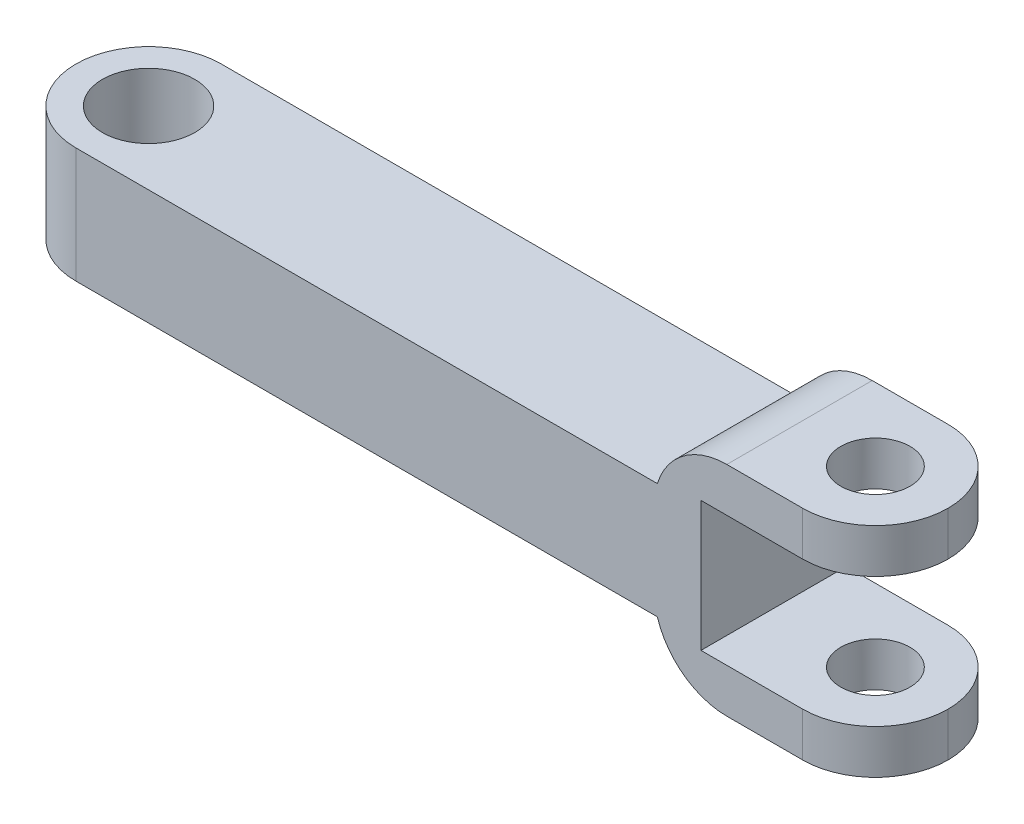
ISO-10303-21;
HEADER;
FILE_DESCRIPTION(('STEP AP214'),'2;1');
FILE_NAME('part.step','',(''),(''),'','','');
FILE_SCHEMA(('AUTOMOTIVE_DESIGN { 1 0 10303 214 1 1 1 1 }'));
ENDSEC;
DATA;
#1=APPLICATION_CONTEXT('core data for automotive mechanical design processes');
#2=APPLICATION_PROTOCOL_DEFINITION('international standard','automotive_design',2000,#1);
#3=PRODUCT_CONTEXT('',#1,'mechanical');
#4=PRODUCT('Part','Part','',(#3));
#5=PRODUCT_RELATED_PRODUCT_CATEGORY('part','',(#4));
#6=PRODUCT_DEFINITION_FORMATION('','',#4);
#7=PRODUCT_DEFINITION_CONTEXT('part definition',#1,'design');
#8=PRODUCT_DEFINITION('design','',#6,#7);
#9=PRODUCT_DEFINITION_SHAPE('','',#8);
#10=(LENGTH_UNIT() NAMED_UNIT(*) SI_UNIT(.MILLI.,.METRE.));
#11=(NAMED_UNIT(*) PLANE_ANGLE_UNIT() SI_UNIT($,.RADIAN.));
#12=(NAMED_UNIT(*) SI_UNIT($,.STERADIAN.) SOLID_ANGLE_UNIT());
#13=UNCERTAINTY_MEASURE_WITH_UNIT(LENGTH_MEASURE(1.E-05),#10,'distance_accuracy_value','');
#14=(GEOMETRIC_REPRESENTATION_CONTEXT(3) GLOBAL_UNCERTAINTY_ASSIGNED_CONTEXT((#13)) GLOBAL_UNIT_ASSIGNED_CONTEXT((#10,
#11,#12)) REPRESENTATION_CONTEXT('',''));
#15=CARTESIAN_POINT('',(0.,0.,0.));
#16=DIRECTION('',(0.,0.,1.));
#17=DIRECTION('',(1.,0.,0.));
#18=AXIS2_PLACEMENT_3D('',#15,#16,#17);
#19=CARTESIAN_POINT('',(0.,0.,10.));
#20=DIRECTION('',(0.,1.,0.));
#21=DIRECTION('',(0.,0.,1.));
#22=AXIS2_PLACEMENT_3D('',#19,#20,#21);
#23=PLANE('',#22);
#24=CARTESIAN_POINT('',(55.,0.,5.));
#25=DIRECTION('',(0.,1.,0.));
#26=DIRECTION('',(0.,0.,1.));
#27=AXIS2_PLACEMENT_3D('',#24,#25,#26);
#28=CIRCLE('',#27,2.38125000000001);
#29=CARTESIAN_POINT('',(55.,0.,7.38125000000001));
#30=VERTEX_POINT('',#29);
#31=EDGE_CURVE('E276',#30,#30,#28,.T.);
#32=ORIENTED_EDGE('',*,*,#31,.T.);
#33=EDGE_LOOP('',(#32));
#34=FACE_BOUND('',#33,.T.);
#35=DIRECTION('',(1.,0.,0.));
#36=VECTOR('',#35,1.);
#37=CARTESIAN_POINT('',(0.,0.,10.));
#38=LINE('',#37,#36);
#39=CARTESIAN_POINT('',(49.7794114111991,0.,10.));
#40=VERTEX_POINT('',#39);
#41=CARTESIAN_POINT('',(55.,0.,10.));
#42=VERTEX_POINT('',#41);
#43=EDGE_CURVE('E211',#40,#42,#38,.T.);
#44=ORIENTED_EDGE('',*,*,#43,.F.);
#45=DIRECTION('',(0.,0.,1.));
#46=VECTOR('',#45,1.);
#47=CARTESIAN_POINT('',(49.7794114111991,0.,10.));
#48=LINE('',#47,#46);
#49=CARTESIAN_POINT('',(49.7794114111991,0.,0.));
#50=VERTEX_POINT('',#49);
#51=EDGE_CURVE('E68',#40,#50,#48,.F.);
#52=ORIENTED_EDGE('',*,*,#51,.T.);
#53=DIRECTION('',(1.,0.,0.));
#54=VECTOR('',#53,1.);
#55=CARTESIAN_POINT('',(0.,0.,0.));
#56=LINE('',#55,#54);
#57=CARTESIAN_POINT('',(55.,0.,0.));
#58=VERTEX_POINT('',#57);
#59=EDGE_CURVE('E212',#50,#58,#56,.T.);
#60=ORIENTED_EDGE('',*,*,#59,.T.);
#61=CARTESIAN_POINT('',(55.,0.,5.));
#62=DIRECTION('',(0.,1.,0.));
#63=DIRECTION('',(0.,0.,1.));
#64=AXIS2_PLACEMENT_3D('',#61,#62,#63);
#65=CIRCLE('',#64,5.);
#66=CARTESIAN_POINT('',(60.,0.,5.));
#67=VERTEX_POINT('',#66);
#68=EDGE_CURVE('E232',#58,#67,#65,.F.);
#69=ORIENTED_EDGE('',*,*,#68,.T.);
#70=CARTESIAN_POINT('',(55.,0.,5.));
#71=DIRECTION('',(0.,1.,0.));
#72=DIRECTION('',(0.,0.,1.));
#73=AXIS2_PLACEMENT_3D('',#70,#71,#72);
#74=CIRCLE('',#73,5.);
#75=EDGE_CURVE('E229',#67,#42,#74,.F.);
#76=ORIENTED_EDGE('',*,*,#75,.T.);
#77=EDGE_LOOP('',(#44,#52,#60,#69,#76));
#78=FACE_BOUND('',#77,.T.);
#79=ADVANCED_FACE('F43',(#34,#78),#23,.F.);
#80=CARTESIAN_POINT('',(0.,15.,10.));
#81=DIRECTION('',(0.,1.,0.));
#82=DIRECTION('',(0.,0.,1.));
#83=AXIS2_PLACEMENT_3D('',#80,#81,#82);
#84=PLANE('',#83);
#85=CARTESIAN_POINT('',(55.,15.,5.));
#86=DIRECTION('',(0.,1.,0.));
#87=DIRECTION('',(0.,0.,1.));
#88=AXIS2_PLACEMENT_3D('',#85,#86,#87);
#89=CIRCLE('',#88,2.38125000000001);
#90=CARTESIAN_POINT('',(55.,15.,7.38125000000001));
#91=VERTEX_POINT('',#90);
#92=EDGE_CURVE('E270',#91,#91,#89,.T.);
#93=ORIENTED_EDGE('',*,*,#92,.F.);
#94=EDGE_LOOP('',(#93));
#95=FACE_BOUND('',#94,.T.);
#96=DIRECTION('',(1.,0.,0.));
#97=VECTOR('',#96,1.);
#98=CARTESIAN_POINT('',(0.,15.,0.));
#99=LINE('',#98,#97);
#100=CARTESIAN_POINT('',(49.7794114111991,15.,0.));
#101=VERTEX_POINT('',#100);
#102=CARTESIAN_POINT('',(55.,15.,0.));
#103=VERTEX_POINT('',#102);
#104=EDGE_CURVE('E207',#101,#103,#99,.T.);
#105=ORIENTED_EDGE('',*,*,#104,.F.);
#106=DIRECTION('',(0.,0.,1.));
#107=VECTOR('',#106,1.);
#108=CARTESIAN_POINT('',(49.7794114111991,15.,10.));
#109=LINE('',#108,#107);
#110=CARTESIAN_POINT('',(49.7794114111991,15.,10.));
#111=VERTEX_POINT('',#110);
#112=EDGE_CURVE('E11',#101,#111,#109,.T.);
#113=ORIENTED_EDGE('',*,*,#112,.T.);
#114=DIRECTION('',(1.,0.,0.));
#115=VECTOR('',#114,1.);
#116=CARTESIAN_POINT('',(0.,15.,10.));
#117=LINE('',#116,#115);
#118=CARTESIAN_POINT('',(55.,15.,10.));
#119=VERTEX_POINT('',#118);
#120=EDGE_CURVE('E160',#111,#119,#117,.T.);
#121=ORIENTED_EDGE('',*,*,#120,.T.);
#122=CARTESIAN_POINT('',(55.,15.,5.));
#123=DIRECTION('',(0.,1.,0.));
#124=DIRECTION('',(0.,0.,1.));
#125=AXIS2_PLACEMENT_3D('',#122,#123,#124);
#126=CIRCLE('',#125,5.);
#127=CARTESIAN_POINT('',(60.,15.,5.));
#128=VERTEX_POINT('',#127);
#129=EDGE_CURVE('E240',#119,#128,#126,.T.);
#130=ORIENTED_EDGE('',*,*,#129,.T.);
#131=CARTESIAN_POINT('',(55.,15.,5.));
#132=DIRECTION('',(0.,1.,0.));
#133=DIRECTION('',(0.,0.,1.));
#134=AXIS2_PLACEMENT_3D('',#131,#132,#133);
#135=CIRCLE('',#134,5.);
#136=EDGE_CURVE('E242',#128,#103,#135,.T.);
#137=ORIENTED_EDGE('',*,*,#136,.T.);
#138=EDGE_LOOP('',(#105,#113,#121,#130,#137));
#139=FACE_BOUND('',#138,.T.);
#140=ADVANCED_FACE('F321',(#95,#139),#84,.T.);
#141=CARTESIAN_POINT('',(0.,0.,10.));
#142=DIRECTION('',(0.,0.,-1.));
#143=DIRECTION('',(-1.,0.,0.));
#144=AXIS2_PLACEMENT_3D('',#141,#142,#143);
#145=PLANE('',#144);
#146=DIRECTION('',(-1.,0.,0.));
#147=VECTOR('',#146,1.);
#148=CARTESIAN_POINT('',(0.,3.53125,10.));
#149=LINE('',#148,#147);
#150=CARTESIAN_POINT('',(45.,3.53125,10.));
#151=VERTEX_POINT('',#150);
#152=CARTESIAN_POINT('',(5.,3.53125,10.));
#153=VERTEX_POINT('',#152);
#154=EDGE_CURVE('E175',#151,#153,#149,.T.);
#155=ORIENTED_EDGE('',*,*,#154,.F.);
#156=CARTESIAN_POINT('',(49.7794114111991,5.,10.));
#157=DIRECTION('',(0.,0.,-1.));
#158=DIRECTION('',(-1.,0.,0.));
#159=AXIS2_PLACEMENT_3D('',#156,#157,#158);
#160=CIRCLE('',#159,5.);
#161=EDGE_CURVE('E164',#151,#40,#160,.F.);
#162=ORIENTED_EDGE('',*,*,#161,.T.);
#163=ORIENTED_EDGE('',*,*,#43,.T.);
#164=DIRECTION('',(0.,1.,0.));
#165=VECTOR('',#164,1.);
#166=CARTESIAN_POINT('',(55.,0.,10.));
#167=LINE('',#166,#165);
#168=CARTESIAN_POINT('',(55.,3.03125,10.));
#169=VERTEX_POINT('',#168);
#170=EDGE_CURVE('E238',#42,#169,#167,.T.);
#171=ORIENTED_EDGE('',*,*,#170,.T.);
#172=DIRECTION('',(-1.,0.,0.));
#173=VECTOR('',#172,1.);
#174=CARTESIAN_POINT('',(60.,3.03125,10.));
#175=LINE('',#174,#173);
#176=CARTESIAN_POINT('',(48.,3.03125,10.));
#177=VERTEX_POINT('',#176);
#178=EDGE_CURVE('E195',#169,#177,#175,.T.);
#179=ORIENTED_EDGE('',*,*,#178,.T.);
#180=DIRECTION('',(0.,1.,0.));
#181=VECTOR('',#180,1.);
#182=CARTESIAN_POINT('',(48.,3.03125,10.));
#183=LINE('',#182,#181);
#184=CARTESIAN_POINT('',(48.,11.96875,10.));
#185=VERTEX_POINT('',#184);
#186=EDGE_CURVE('E179',#177,#185,#183,.T.);
#187=ORIENTED_EDGE('',*,*,#186,.T.);
#188=DIRECTION('',(-1.,0.,0.));
#189=VECTOR('',#188,1.);
#190=CARTESIAN_POINT('',(60.,11.96875,10.));
#191=LINE('',#190,#189);
#192=CARTESIAN_POINT('',(55.,11.96875,10.));
#193=VERTEX_POINT('',#192);
#194=EDGE_CURVE('E177',#193,#185,#191,.T.);
#195=ORIENTED_EDGE('',*,*,#194,.F.);
#196=DIRECTION('',(0.,1.,0.));
#197=VECTOR('',#196,1.);
#198=CARTESIAN_POINT('',(55.,0.,10.));
#199=LINE('',#198,#197);
#200=EDGE_CURVE('E236',#193,#119,#199,.T.);
#201=ORIENTED_EDGE('',*,*,#200,.T.);
#202=ORIENTED_EDGE('',*,*,#120,.F.);
#203=CARTESIAN_POINT('',(49.7794114111991,10.,10.));
#204=DIRECTION('',(0.,0.,-1.));
#205=DIRECTION('',(-1.,0.,0.));
#206=AXIS2_PLACEMENT_3D('',#203,#204,#205);
#207=CIRCLE('',#206,5.);
#208=CARTESIAN_POINT('',(45.,11.46875,10.));
#209=VERTEX_POINT('',#208);
#210=EDGE_CURVE('E153',#111,#209,#207,.F.);
#211=ORIENTED_EDGE('',*,*,#210,.T.);
#212=DIRECTION('',(1.,0.,0.));
#213=VECTOR('',#212,1.);
#214=CARTESIAN_POINT('',(0.,11.46875,10.));
#215=LINE('',#214,#213);
#216=CARTESIAN_POINT('',(5.,11.46875,10.));
#217=VERTEX_POINT('',#216);
#218=EDGE_CURVE('E157',#217,#209,#215,.T.);
#219=ORIENTED_EDGE('',*,*,#218,.F.);
#220=DIRECTION('',(0.,1.,0.));
#221=VECTOR('',#220,1.);
#222=CARTESIAN_POINT('',(5.,3.53125,10.));
#223=LINE('',#222,#221);
#224=EDGE_CURVE('E234',#217,#153,#223,.F.);
#225=ORIENTED_EDGE('',*,*,#224,.T.);
#226=EDGE_LOOP('',(#155,#162,#163,#171,#179,#187,#195,#201,#202,#211,#219,#225));
#227=FACE_BOUND('',#226,.T.);
#228=ADVANCED_FACE('F156',(#227),#145,.F.);
#229=CARTESIAN_POINT('',(0.,0.,0.));
#230=DIRECTION('',(0.,0.,-1.));
#231=DIRECTION('',(-1.,0.,0.));
#232=AXIS2_PLACEMENT_3D('',#229,#230,#231);
#233=PLANE('',#232);
#234=ORIENTED_EDGE('',*,*,#59,.F.);
#235=CARTESIAN_POINT('',(49.7794114111991,5.,0.));
#236=DIRECTION('',(0.,0.,-1.));
#237=DIRECTION('',(-1.,0.,0.));
#238=AXIS2_PLACEMENT_3D('',#235,#236,#237);
#239=CIRCLE('',#238,5.);
#240=CARTESIAN_POINT('',(45.,3.53125,0.));
#241=VERTEX_POINT('',#240);
#242=EDGE_CURVE('E52',#50,#241,#239,.T.);
#243=ORIENTED_EDGE('',*,*,#242,.T.);
#244=DIRECTION('',(-1.,0.,0.));
#245=VECTOR('',#244,1.);
#246=CARTESIAN_POINT('',(0.,3.53125,0.));
#247=LINE('',#246,#245);
#248=CARTESIAN_POINT('',(5.,3.53125,0.));
#249=VERTEX_POINT('',#248);
#250=EDGE_CURVE('E186',#241,#249,#247,.T.);
#251=ORIENTED_EDGE('',*,*,#250,.T.);
#252=DIRECTION('',(0.,1.,0.));
#253=VECTOR('',#252,1.);
#254=CARTESIAN_POINT('',(5.,0.,0.));
#255=LINE('',#254,#253);
#256=CARTESIAN_POINT('',(5.,11.46875,0.));
#257=VERTEX_POINT('',#256);
#258=EDGE_CURVE('E220',#249,#257,#255,.T.);
#259=ORIENTED_EDGE('',*,*,#258,.T.);
#260=DIRECTION('',(1.,0.,0.));
#261=VECTOR('',#260,1.);
#262=CARTESIAN_POINT('',(0.,11.46875,0.));
#263=LINE('',#262,#261);
#264=CARTESIAN_POINT('',(45.,11.46875,0.));
#265=VERTEX_POINT('',#264);
#266=EDGE_CURVE('E174',#257,#265,#263,.T.);
#267=ORIENTED_EDGE('',*,*,#266,.T.);
#268=CARTESIAN_POINT('',(49.7794114111991,10.,0.));
#269=DIRECTION('',(0.,0.,-1.));
#270=DIRECTION('',(-1.,0.,0.));
#271=AXIS2_PLACEMENT_3D('',#268,#269,#270);
#272=CIRCLE('',#271,5.);
#273=EDGE_CURVE('E60',#265,#101,#272,.T.);
#274=ORIENTED_EDGE('',*,*,#273,.T.);
#275=ORIENTED_EDGE('',*,*,#104,.T.);
#276=DIRECTION('',(0.,1.,0.));
#277=VECTOR('',#276,1.);
#278=CARTESIAN_POINT('',(55.,11.96875,0.));
#279=LINE('',#278,#277);
#280=CARTESIAN_POINT('',(55.,11.96875,0.));
#281=VERTEX_POINT('',#280);
#282=EDGE_CURVE('E223',#103,#281,#279,.F.);
#283=ORIENTED_EDGE('',*,*,#282,.T.);
#284=DIRECTION('',(-1.,0.,0.));
#285=VECTOR('',#284,1.);
#286=CARTESIAN_POINT('',(60.,11.96875,0.));
#287=LINE('',#286,#285);
#288=CARTESIAN_POINT('',(48.,11.96875,0.));
#289=VERTEX_POINT('',#288);
#290=EDGE_CURVE('E192',#281,#289,#287,.T.);
#291=ORIENTED_EDGE('',*,*,#290,.T.);
#292=DIRECTION('',(0.,1.,0.));
#293=VECTOR('',#292,1.);
#294=CARTESIAN_POINT('',(48.,3.03125,0.));
#295=LINE('',#294,#293);
#296=CARTESIAN_POINT('',(48.,3.03125,0.));
#297=VERTEX_POINT('',#296);
#298=EDGE_CURVE('E194',#297,#289,#295,.T.);
#299=ORIENTED_EDGE('',*,*,#298,.F.);
#300=DIRECTION('',(-1.,0.,0.));
#301=VECTOR('',#300,1.);
#302=CARTESIAN_POINT('',(60.,3.03125,0.));
#303=LINE('',#302,#301);
#304=CARTESIAN_POINT('',(55.,3.03125,0.));
#305=VERTEX_POINT('',#304);
#306=EDGE_CURVE('E198',#305,#297,#303,.T.);
#307=ORIENTED_EDGE('',*,*,#306,.F.);
#308=DIRECTION('',(0.,1.,0.));
#309=VECTOR('',#308,1.);
#310=CARTESIAN_POINT('',(55.,0.,0.));
#311=LINE('',#310,#309);
#312=EDGE_CURVE('E226',#305,#58,#311,.F.);
#313=ORIENTED_EDGE('',*,*,#312,.T.);
#314=EDGE_LOOP('',(#234,#243,#251,#259,#267,#274,#275,#283,#291,#299,#307,#313));
#315=FACE_BOUND('',#314,.T.);
#316=ADVANCED_FACE('F311',(#315),#233,.T.);
#317=CARTESIAN_POINT('',(60.,11.96875,0.));
#318=DIRECTION('',(0.,1.,0.));
#319=DIRECTION('',(-1.,0.,0.));
#320=AXIS2_PLACEMENT_3D('',#317,#318,#319);
#321=PLANE('',#320);
#322=CARTESIAN_POINT('',(55.,11.96875,5.));
#323=DIRECTION('',(0.,1.,0.));
#324=DIRECTION('',(-1.,0.,0.));
#325=AXIS2_PLACEMENT_3D('',#322,#323,#324);
#326=CIRCLE('',#325,2.38125000000001);
#327=CARTESIAN_POINT('',(52.61875,11.96875,5.));
#328=VERTEX_POINT('',#327);
#329=EDGE_CURVE('E262',#328,#328,#326,.T.);
#330=ORIENTED_EDGE('',*,*,#329,.T.);
#331=EDGE_LOOP('',(#330));
#332=FACE_BOUND('',#331,.T.);
#333=ORIENTED_EDGE('',*,*,#290,.F.);
#334=CARTESIAN_POINT('',(55.,11.96875,5.));
#335=DIRECTION('',(0.,1.,0.));
#336=DIRECTION('',(-1.,0.,0.));
#337=AXIS2_PLACEMENT_3D('',#334,#335,#336);
#338=CIRCLE('',#337,5.);
#339=CARTESIAN_POINT('',(60.,11.96875,5.));
#340=VERTEX_POINT('',#339);
#341=EDGE_CURVE('E247',#281,#340,#338,.F.);
#342=ORIENTED_EDGE('',*,*,#341,.T.);
#343=CARTESIAN_POINT('',(55.,11.96875,5.));
#344=DIRECTION('',(0.,1.,0.));
#345=DIRECTION('',(-1.,0.,0.));
#346=AXIS2_PLACEMENT_3D('',#343,#344,#345);
#347=CIRCLE('',#346,5.);
#348=EDGE_CURVE('E245',#340,#193,#347,.F.);
#349=ORIENTED_EDGE('',*,*,#348,.T.);
#350=ORIENTED_EDGE('',*,*,#194,.T.);
#351=DIRECTION('',(0.,0.,1.));
#352=VECTOR('',#351,1.);
#353=CARTESIAN_POINT('',(48.,11.96875,0.));
#354=LINE('',#353,#352);
#355=EDGE_CURVE('E199',#289,#185,#354,.T.);
#356=ORIENTED_EDGE('',*,*,#355,.F.);
#357=EDGE_LOOP('',(#333,#342,#349,#350,#356));
#358=FACE_BOUND('',#357,.T.);
#359=ADVANCED_FACE('F296',(#332,#358),#321,.F.);
#360=CARTESIAN_POINT('',(60.,3.03125,0.));
#361=DIRECTION('',(0.,1.,0.));
#362=DIRECTION('',(-1.,0.,0.));
#363=AXIS2_PLACEMENT_3D('',#360,#361,#362);
#364=PLANE('',#363);
#365=CARTESIAN_POINT('',(55.,3.03125,5.));
#366=DIRECTION('',(0.,1.,0.));
#367=DIRECTION('',(-1.,0.,0.));
#368=AXIS2_PLACEMENT_3D('',#365,#366,#367);
#369=CIRCLE('',#368,2.38125000000001);
#370=CARTESIAN_POINT('',(52.61875,3.03125,5.));
#371=VERTEX_POINT('',#370);
#372=EDGE_CURVE('E47',#371,#371,#369,.T.);
#373=ORIENTED_EDGE('',*,*,#372,.F.);
#374=EDGE_LOOP('',(#373));
#375=FACE_BOUND('',#374,.T.);
#376=CARTESIAN_POINT('',(55.,3.03125,5.));
#377=DIRECTION('',(0.,1.,0.));
#378=DIRECTION('',(-1.,0.,0.));
#379=AXIS2_PLACEMENT_3D('',#376,#377,#378);
#380=CIRCLE('',#379,5.);
#381=CARTESIAN_POINT('',(60.,3.03125,5.));
#382=VERTEX_POINT('',#381);
#383=EDGE_CURVE('E214',#169,#382,#380,.T.);
#384=ORIENTED_EDGE('',*,*,#383,.T.);
#385=CARTESIAN_POINT('',(55.,3.03125,5.));
#386=DIRECTION('',(0.,1.,0.));
#387=DIRECTION('',(-1.,0.,0.));
#388=AXIS2_PLACEMENT_3D('',#385,#386,#387);
#389=CIRCLE('',#388,5.);
#390=EDGE_CURVE('E218',#382,#305,#389,.T.);
#391=ORIENTED_EDGE('',*,*,#390,.T.);
#392=ORIENTED_EDGE('',*,*,#306,.T.);
#393=DIRECTION('',(0.,0.,1.));
#394=VECTOR('',#393,1.);
#395=CARTESIAN_POINT('',(48.,3.03125,0.));
#396=LINE('',#395,#394);
#397=EDGE_CURVE('E204',#297,#177,#396,.T.);
#398=ORIENTED_EDGE('',*,*,#397,.T.);
#399=ORIENTED_EDGE('',*,*,#178,.F.);
#400=EDGE_LOOP('',(#384,#391,#392,#398,#399));
#401=FACE_BOUND('',#400,.T.);
#402=ADVANCED_FACE('F292',(#375,#401),#364,.T.);
#403=CARTESIAN_POINT('',(48.,3.03125,0.));
#404=DIRECTION('',(1.,0.,0.));
#405=DIRECTION('',(0.,1.,0.));
#406=AXIS2_PLACEMENT_3D('',#403,#404,#405);
#407=PLANE('',#406);
#408=ORIENTED_EDGE('',*,*,#186,.F.);
#409=ORIENTED_EDGE('',*,*,#397,.F.);
#410=ORIENTED_EDGE('',*,*,#298,.T.);
#411=ORIENTED_EDGE('',*,*,#355,.T.);
#412=EDGE_LOOP('',(#408,#409,#410,#411));
#413=FACE_BOUND('',#412,.T.);
#414=ADVANCED_FACE('F295',(#413),#407,.T.);
#415=CARTESIAN_POINT('',(0.,3.53125,0.));
#416=DIRECTION('',(0.,1.,0.));
#417=DIRECTION('',(0.,0.,1.));
#418=AXIS2_PLACEMENT_3D('',#415,#416,#417);
#419=PLANE('',#418);
#420=CARTESIAN_POINT('',(5.,3.53125,5.));
#421=DIRECTION('',(0.,1.,0.));
#422=DIRECTION('',(0.,0.,1.));
#423=AXIS2_PLACEMENT_3D('',#420,#421,#422);
#424=CIRCLE('',#423,3.175);
#425=CARTESIAN_POINT('',(5.,3.53125,8.175));
#426=VERTEX_POINT('',#425);
#427=EDGE_CURVE('E269',#426,#426,#424,.T.);
#428=ORIENTED_EDGE('',*,*,#427,.T.);
#429=EDGE_LOOP('',(#428));
#430=FACE_BOUND('',#429,.T.);
#431=CARTESIAN_POINT('',(5.,3.53125,5.));
#432=DIRECTION('',(0.,1.,0.));
#433=DIRECTION('',(0.,0.,1.));
#434=AXIS2_PLACEMENT_3D('',#431,#432,#433);
#435=CIRCLE('',#434,5.);
#436=CARTESIAN_POINT('',(0.,3.53125,5.));
#437=VERTEX_POINT('',#436);
#438=EDGE_CURVE('E252',#153,#437,#435,.F.);
#439=ORIENTED_EDGE('',*,*,#438,.T.);
#440=CARTESIAN_POINT('',(5.,3.53125,5.));
#441=DIRECTION('',(0.,1.,0.));
#442=DIRECTION('',(0.,0.,1.));
#443=AXIS2_PLACEMENT_3D('',#440,#441,#442);
#444=CIRCLE('',#443,5.);
#445=EDGE_CURVE('E165',#437,#249,#444,.F.);
#446=ORIENTED_EDGE('',*,*,#445,.T.);
#447=ORIENTED_EDGE('',*,*,#250,.F.);
#448=DIRECTION('',(0.,0.,1.));
#449=VECTOR('',#448,1.);
#450=CARTESIAN_POINT('',(45.,3.53125,0.));
#451=LINE('',#450,#449);
#452=EDGE_CURVE('E183',#241,#151,#451,.T.);
#453=ORIENTED_EDGE('',*,*,#452,.T.);
#454=ORIENTED_EDGE('',*,*,#154,.T.);
#455=EDGE_LOOP('',(#439,#446,#447,#453,#454));
#456=FACE_BOUND('',#455,.T.);
#457=ADVANCED_FACE('F363',(#430,#456),#419,.F.);
#458=CARTESIAN_POINT('',(0.,11.46875,0.));
#459=DIRECTION('',(0.,-1.,0.));
#460=DIRECTION('',(0.,0.,-1.));
#461=AXIS2_PLACEMENT_3D('',#458,#459,#460);
#462=PLANE('',#461);
#463=CARTESIAN_POINT('',(5.,11.46875,5.));
#464=DIRECTION('',(0.,-1.,0.));
#465=DIRECTION('',(0.,0.,-1.));
#466=AXIS2_PLACEMENT_3D('',#463,#464,#465);
#467=CIRCLE('',#466,3.175);
#468=CARTESIAN_POINT('',(5.,11.46875,1.825));
#469=VERTEX_POINT('',#468);
#470=EDGE_CURVE('E267',#469,#469,#467,.T.);
#471=ORIENTED_EDGE('',*,*,#470,.T.);
#472=EDGE_LOOP('',(#471));
#473=FACE_BOUND('',#472,.T.);
#474=ORIENTED_EDGE('',*,*,#266,.F.);
#475=CARTESIAN_POINT('',(5.,11.46875,5.));
#476=DIRECTION('',(0.,-1.,0.));
#477=DIRECTION('',(0.,0.,-1.));
#478=AXIS2_PLACEMENT_3D('',#475,#476,#477);
#479=CIRCLE('',#478,5.);
#480=CARTESIAN_POINT('',(0.,11.46875,5.));
#481=VERTEX_POINT('',#480);
#482=EDGE_CURVE('E250',#257,#481,#479,.F.);
#483=ORIENTED_EDGE('',*,*,#482,.T.);
#484=CARTESIAN_POINT('',(5.,11.46875,5.));
#485=DIRECTION('',(0.,-1.,0.));
#486=DIRECTION('',(0.,0.,-1.));
#487=AXIS2_PLACEMENT_3D('',#484,#485,#486);
#488=CIRCLE('',#487,5.);
#489=EDGE_CURVE('E173',#481,#217,#488,.F.);
#490=ORIENTED_EDGE('',*,*,#489,.T.);
#491=ORIENTED_EDGE('',*,*,#218,.T.);
#492=DIRECTION('',(0.,0.,1.));
#493=VECTOR('',#492,1.);
#494=CARTESIAN_POINT('',(45.,11.46875,0.));
#495=LINE('',#494,#493);
#496=EDGE_CURVE('E171',#265,#209,#495,.T.);
#497=ORIENTED_EDGE('',*,*,#496,.F.);
#498=EDGE_LOOP('',(#474,#483,#490,#491,#497));
#499=FACE_BOUND('',#498,.T.);
#500=ADVANCED_FACE('F170',(#473,#499),#462,.F.);
#501=CARTESIAN_POINT('',(55.,0.,5.));
#502=DIRECTION('',(0.,1.,0.));
#503=DIRECTION('',(0.,0.,1.));
#504=AXIS2_PLACEMENT_3D('',#501,#502,#503);
#505=CYLINDRICAL_SURFACE('',#504,5.);
#506=ORIENTED_EDGE('',*,*,#170,.F.);
#507=ORIENTED_EDGE('',*,*,#75,.F.);
#508=DIRECTION('',(0.,1.,0.));
#509=VECTOR('',#508,1.);
#510=CARTESIAN_POINT('',(60.,0.,5.));
#511=LINE('',#510,#509);
#512=EDGE_CURVE('E187',#382,#67,#511,.F.);
#513=ORIENTED_EDGE('',*,*,#512,.F.);
#514=ORIENTED_EDGE('',*,*,#383,.F.);
#515=EDGE_LOOP('',(#506,#507,#513,#514));
#516=FACE_BOUND('',#515,.T.);
#517=ADVANCED_FACE('F306',(#516),#505,.T.);
#518=CARTESIAN_POINT('',(55.,0.,5.));
#519=DIRECTION('',(0.,-1.,0.));
#520=DIRECTION('',(0.,0.,-1.));
#521=AXIS2_PLACEMENT_3D('',#518,#519,#520);
#522=CYLINDRICAL_SURFACE('',#521,5.);
#523=ORIENTED_EDGE('',*,*,#68,.F.);
#524=ORIENTED_EDGE('',*,*,#312,.F.);
#525=ORIENTED_EDGE('',*,*,#390,.F.);
#526=ORIENTED_EDGE('',*,*,#512,.T.);
#527=EDGE_LOOP('',(#523,#524,#525,#526));
#528=FACE_BOUND('',#527,.T.);
#529=ADVANCED_FACE('F310',(#528),#522,.T.);
#530=CARTESIAN_POINT('',(55.,0.,5.));
#531=DIRECTION('',(0.,1.,0.));
#532=DIRECTION('',(0.,0.,1.));
#533=AXIS2_PLACEMENT_3D('',#530,#531,#532);
#534=CYLINDRICAL_SURFACE('',#533,5.);
#535=ORIENTED_EDGE('',*,*,#200,.F.);
#536=ORIENTED_EDGE('',*,*,#348,.F.);
#537=DIRECTION('',(0.,1.,0.));
#538=VECTOR('',#537,1.);
#539=CARTESIAN_POINT('',(60.,0.,5.));
#540=LINE('',#539,#538);
#541=EDGE_CURVE('E257',#128,#340,#540,.F.);
#542=ORIENTED_EDGE('',*,*,#541,.F.);
#543=ORIENTED_EDGE('',*,*,#129,.F.);
#544=EDGE_LOOP('',(#535,#536,#542,#543));
#545=FACE_BOUND('',#544,.T.);
#546=ADVANCED_FACE('F335',(#545),#534,.T.);
#547=CARTESIAN_POINT('',(55.,0.,5.));
#548=DIRECTION('',(0.,-1.,0.));
#549=DIRECTION('',(0.,0.,-1.));
#550=AXIS2_PLACEMENT_3D('',#547,#548,#549);
#551=CYLINDRICAL_SURFACE('',#550,5.);
#552=ORIENTED_EDGE('',*,*,#341,.F.);
#553=ORIENTED_EDGE('',*,*,#282,.F.);
#554=ORIENTED_EDGE('',*,*,#136,.F.);
#555=ORIENTED_EDGE('',*,*,#541,.T.);
#556=EDGE_LOOP('',(#552,#553,#554,#555));
#557=FACE_BOUND('',#556,.T.);
#558=ADVANCED_FACE('F338',(#557),#551,.T.);
#559=CARTESIAN_POINT('',(5.,0.,5.));
#560=DIRECTION('',(0.,-1.,0.));
#561=DIRECTION('',(0.,0.,-1.));
#562=AXIS2_PLACEMENT_3D('',#559,#560,#561);
#563=CYLINDRICAL_SURFACE('',#562,5.);
#564=DIRECTION('',(0.,1.,0.));
#565=VECTOR('',#564,1.);
#566=CARTESIAN_POINT('',(0.,11.46875,5.));
#567=LINE('',#566,#565);
#568=EDGE_CURVE('E260',#437,#481,#567,.T.);
#569=ORIENTED_EDGE('',*,*,#568,.F.);
#570=ORIENTED_EDGE('',*,*,#438,.F.);
#571=ORIENTED_EDGE('',*,*,#224,.F.);
#572=ORIENTED_EDGE('',*,*,#489,.F.);
#573=EDGE_LOOP('',(#569,#570,#571,#572));
#574=FACE_BOUND('',#573,.T.);
#575=ADVANCED_FACE('F341',(#574),#563,.T.);
#576=CARTESIAN_POINT('',(5.,0.,5.));
#577=DIRECTION('',(0.,1.,0.));
#578=DIRECTION('',(0.,0.,1.));
#579=AXIS2_PLACEMENT_3D('',#576,#577,#578);
#580=CYLINDRICAL_SURFACE('',#579,5.);
#581=ORIENTED_EDGE('',*,*,#445,.F.);
#582=ORIENTED_EDGE('',*,*,#568,.T.);
#583=ORIENTED_EDGE('',*,*,#482,.F.);
#584=ORIENTED_EDGE('',*,*,#258,.F.);
#585=EDGE_LOOP('',(#581,#582,#583,#584));
#586=FACE_BOUND('',#585,.T.);
#587=ADVANCED_FACE('F346',(#586),#580,.T.);
#588=CARTESIAN_POINT('',(49.7794114111991,5.,0.));
#589=DIRECTION('',(0.,0.,1.));
#590=DIRECTION('',(1.,0.,0.));
#591=AXIS2_PLACEMENT_3D('',#588,#589,#590);
#592=CYLINDRICAL_SURFACE('',#591,5.);
#593=ORIENTED_EDGE('',*,*,#242,.F.);
#594=ORIENTED_EDGE('',*,*,#51,.F.);
#595=ORIENTED_EDGE('',*,*,#161,.F.);
#596=ORIENTED_EDGE('',*,*,#452,.F.);
#597=EDGE_LOOP('',(#593,#594,#595,#596));
#598=FACE_BOUND('',#597,.T.);
#599=ADVANCED_FACE('F349',(#598),#592,.T.);
#600=CARTESIAN_POINT('',(49.7794114111991,10.,0.));
#601=DIRECTION('',(0.,0.,-1.));
#602=DIRECTION('',(-1.,0.,0.));
#603=AXIS2_PLACEMENT_3D('',#600,#601,#602);
#604=CYLINDRICAL_SURFACE('',#603,5.);
#605=ORIENTED_EDGE('',*,*,#273,.F.);
#606=ORIENTED_EDGE('',*,*,#496,.T.);
#607=ORIENTED_EDGE('',*,*,#210,.F.);
#608=ORIENTED_EDGE('',*,*,#112,.F.);
#609=EDGE_LOOP('',(#605,#606,#607,#608));
#610=FACE_BOUND('',#609,.T.);
#611=ADVANCED_FACE('F45',(#610),#604,.T.);
#612=CARTESIAN_POINT('',(5.,0.,5.));
#613=DIRECTION('',(0.,1.,0.));
#614=DIRECTION('',(0.,0.,1.));
#615=AXIS2_PLACEMENT_3D('',#612,#613,#614);
#616=CYLINDRICAL_SURFACE('',#615,3.175);
#617=ORIENTED_EDGE('',*,*,#470,.F.);
#618=EDGE_LOOP('',(#617));
#619=FACE_BOUND('',#618,.T.);
#620=ORIENTED_EDGE('',*,*,#427,.F.);
#621=EDGE_LOOP('',(#620));
#622=FACE_BOUND('',#621,.T.);
#623=ADVANCED_FACE('F358',(#619,#622),#616,.F.);
#624=CARTESIAN_POINT('',(55.,0.,5.));
#625=DIRECTION('',(0.,1.,0.));
#626=DIRECTION('',(0.,0.,1.));
#627=AXIS2_PLACEMENT_3D('',#624,#625,#626);
#628=CYLINDRICAL_SURFACE('',#627,2.38125000000001);
#629=ORIENTED_EDGE('',*,*,#372,.T.);
#630=EDGE_LOOP('',(#629));
#631=FACE_BOUND('',#630,.T.);
#632=ORIENTED_EDGE('',*,*,#31,.F.);
#633=EDGE_LOOP('',(#632));
#634=FACE_BOUND('',#633,.T.);
#635=ADVANCED_FACE('F289',(#631,#634),#628,.F.);
#636=ORIENTED_EDGE('',*,*,#92,.T.);
#637=EDGE_LOOP('',(#636));
#638=FACE_BOUND('',#637,.T.);
#639=ORIENTED_EDGE('',*,*,#329,.F.);
#640=EDGE_LOOP('',(#639));
#641=FACE_BOUND('',#640,.T.);
#642=ADVANCED_FACE('F487',(#638,#641),#628,.F.);
#643=CLOSED_SHELL('',(#79,#140,#228,#316,#359,#402,#414,#457,#500,#517,#529,#546,#558,#575,#587,
#599,#611,#623,#635,#642));
#644=MANIFOLD_SOLID_BREP('B2',#643);
#645=ADVANCED_BREP_SHAPE_REPRESENTATION('',(#18,#644),#14);
#646=SHAPE_DEFINITION_REPRESENTATION(#9,#645);
ENDSEC;
END-ISO-10303-21;
